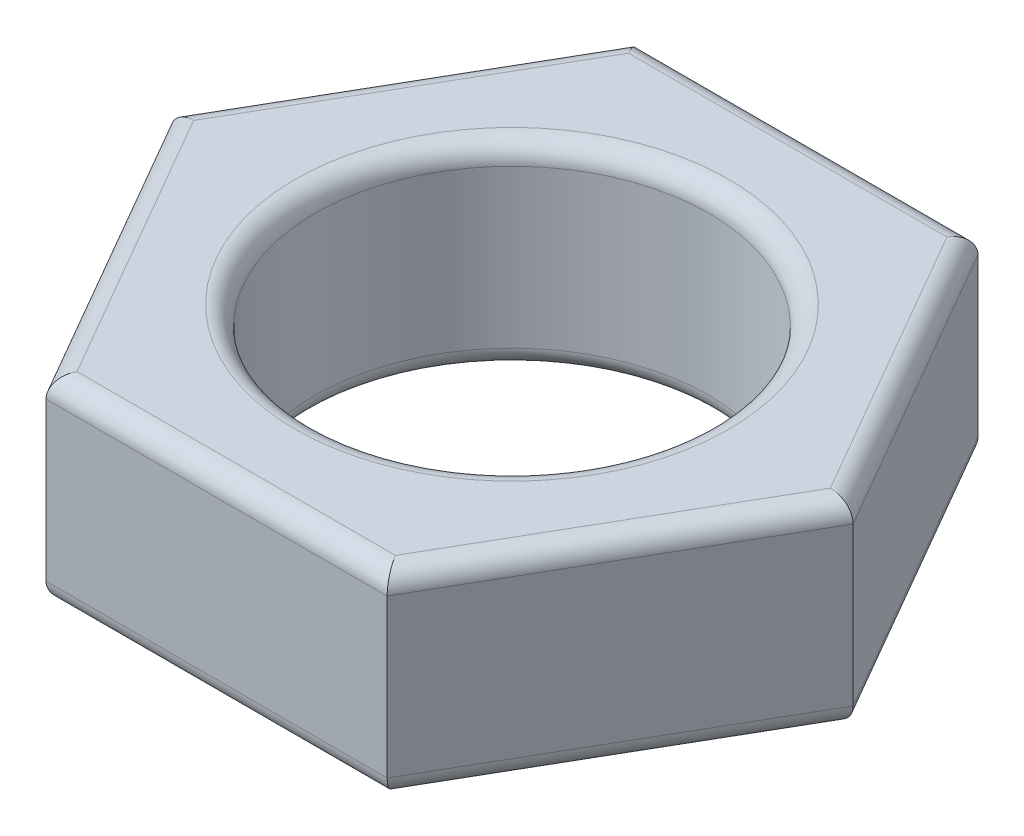
ISO-10303-21;
HEADER;
FILE_DESCRIPTION(('STEP AP214'),'2;1');
FILE_NAME('part.step','',(''),(''),'','','');
FILE_SCHEMA(('AUTOMOTIVE_DESIGN { 1 0 10303 214 1 1 1 1 }'));
ENDSEC;
DATA;
#1=APPLICATION_CONTEXT('core data for automotive mechanical design processes');
#2=APPLICATION_PROTOCOL_DEFINITION('international standard','automotive_design',2000,#1);
#3=PRODUCT_CONTEXT('',#1,'mechanical');
#4=PRODUCT('Part','Part','',(#3));
#5=PRODUCT_RELATED_PRODUCT_CATEGORY('part','',(#4));
#6=PRODUCT_DEFINITION_FORMATION('','',#4);
#7=PRODUCT_DEFINITION_CONTEXT('part definition',#1,'design');
#8=PRODUCT_DEFINITION('design','',#6,#7);
#9=PRODUCT_DEFINITION_SHAPE('','',#8);
#10=(LENGTH_UNIT() NAMED_UNIT(*) SI_UNIT(.MILLI.,.METRE.));
#11=(NAMED_UNIT(*) PLANE_ANGLE_UNIT() SI_UNIT($,.RADIAN.));
#12=(NAMED_UNIT(*) SI_UNIT($,.STERADIAN.) SOLID_ANGLE_UNIT());
#13=UNCERTAINTY_MEASURE_WITH_UNIT(LENGTH_MEASURE(1.E-05),#10,'distance_accuracy_value','');
#14=(GEOMETRIC_REPRESENTATION_CONTEXT(3) GLOBAL_UNCERTAINTY_ASSIGNED_CONTEXT((#13)) GLOBAL_UNIT_ASSIGNED_CONTEXT((#10,
#11,#12)) REPRESENTATION_CONTEXT('',''));
#15=CARTESIAN_POINT('',(0.,0.,0.));
#16=DIRECTION('',(0.,0.,1.));
#17=DIRECTION('',(1.,0.,0.));
#18=AXIS2_PLACEMENT_3D('',#15,#16,#17);
#19=CARTESIAN_POINT('',(0.,5.,0.));
#20=DIRECTION('',(0.,0.999999999999982,0.));
#21=DIRECTION('',(0.,0.,0.999999999999999));
#22=AXIS2_PLACEMENT_3D('',#19,#20,#21);
#23=PLANE('',#22);
#24=CARTESIAN_POINT('',(0.,5.,0.));
#25=DIRECTION('',(0.,0.999999999999982,0.));
#26=DIRECTION('',(0.,0.,0.999999999999999));
#27=AXIS2_PLACEMENT_3D('',#24,#25,#26);
#28=CIRCLE('',#27,5.5);
#29=CARTESIAN_POINT('',(0.,5.,5.5));
#30=VERTEX_POINT('',#29);
#31=EDGE_CURVE('E13',#30,#30,#28,.F.);
#32=ORIENTED_EDGE('',*,*,#31,.T.);
#33=EDGE_LOOP('',(#32));
#34=FACE_BOUND('',#33,.T.);
#35=DIRECTION('',(-0.5,0.,0.866025403784439));
#36=VECTOR('',#35,1.);
#37=CARTESIAN_POINT('',(-8.22724133595193,5.,0.249999999999903));
#38=LINE('',#37,#36);
#39=CARTESIAN_POINT('',(-4.04145188432742,5.,-7.00000000000002));
#40=VERTEX_POINT('',#39);
#41=CARTESIAN_POINT('',(-8.08290376865478,5.,0.));
#42=VERTEX_POINT('',#41);
#43=EDGE_CURVE('E63',#40,#42,#38,.T.);
#44=ORIENTED_EDGE('',*,*,#43,.T.);
#45=DIRECTION('',(0.5,0.,0.866025403784438));
#46=VECTOR('',#45,1.);
#47=CARTESIAN_POINT('',(-3.89711431703005,5.,7.25000000000001));
#48=LINE('',#47,#46);
#49=CARTESIAN_POINT('',(-4.04145188432747,5.,6.99999999999996));
#50=VERTEX_POINT('',#49);
#51=EDGE_CURVE('E55',#42,#50,#48,.T.);
#52=ORIENTED_EDGE('',*,*,#51,.T.);
#53=DIRECTION('',(1.,0.,0.));
#54=VECTOR('',#53,1.);
#55=CARTESIAN_POINT('',(4.33012701892227,5.,6.99999999999998));
#56=LINE('',#55,#54);
#57=CARTESIAN_POINT('',(4.04145188432736,5.,6.99999999999991));
#58=VERTEX_POINT('',#57);
#59=EDGE_CURVE('E202',#50,#58,#56,.T.);
#60=ORIENTED_EDGE('',*,*,#59,.T.);
#61=DIRECTION('',(0.5,0.,-0.866025403784439));
#62=VECTOR('',#61,1.);
#63=CARTESIAN_POINT('',(8.22724133595215,5.,-0.250000000000056));
#64=LINE('',#63,#62);
#65=CARTESIAN_POINT('',(8.08290376865464,5.,0.));
#66=VERTEX_POINT('',#65);
#67=EDGE_CURVE('E204',#58,#66,#64,.T.);
#68=ORIENTED_EDGE('',*,*,#67,.T.);
#69=DIRECTION('',(-0.5,0.,-0.866025403784439));
#70=VECTOR('',#69,1.);
#71=CARTESIAN_POINT('',(3.89711431702985,5.,-7.24999999999987));
#72=LINE('',#71,#70);
#73=CARTESIAN_POINT('',(4.04145188432725,5.,-7.00000000000006));
#74=VERTEX_POINT('',#73);
#75=EDGE_CURVE('E206',#66,#74,#72,.T.);
#76=ORIENTED_EDGE('',*,*,#75,.T.);
#77=DIRECTION('',(-1.,0.,0.));
#78=VECTOR('',#77,1.);
#79=CARTESIAN_POINT('',(-4.3301270189223,5.,-7.00000000000004));
#80=LINE('',#79,#78);
#81=EDGE_CURVE('E68',#74,#40,#80,.T.);
#82=ORIENTED_EDGE('',*,*,#81,.T.);
#83=EDGE_LOOP('',(#44,#52,#60,#68,#76,#82));
#84=FACE_BOUND('',#83,.T.);
#85=ADVANCED_FACE('F46',(#34,#84),#23,.T.);
#86=CARTESIAN_POINT('',(0.,0.,0.));
#87=DIRECTION('',(0.,0.999999999999982,0.));
#88=DIRECTION('',(0.,0.,0.999999999999999));
#89=AXIS2_PLACEMENT_3D('',#86,#87,#88);
#90=PLANE('',#89);
#91=CARTESIAN_POINT('',(0.,0.,0.));
#92=DIRECTION('',(0.,0.999999999999982,0.));
#93=DIRECTION('',(0.,0.,0.999999999999999));
#94=AXIS2_PLACEMENT_3D('',#91,#92,#93);
#95=CIRCLE('',#94,5.5);
#96=CARTESIAN_POINT('',(0.,0.,5.5));
#97=VERTEX_POINT('',#96);
#98=EDGE_CURVE('E164',#97,#97,#95,.T.);
#99=ORIENTED_EDGE('',*,*,#98,.T.);
#100=EDGE_LOOP('',(#99));
#101=FACE_BOUND('',#100,.T.);
#102=DIRECTION('',(-0.5,0.,-0.866025403784439));
#103=VECTOR('',#102,1.);
#104=CARTESIAN_POINT('',(6.06217782649099,0.,-3.50000000000004));
#105=LINE('',#104,#103);
#106=CARTESIAN_POINT('',(4.04145188432725,0.,-7.00000000000006));
#107=VERTEX_POINT('',#106);
#108=CARTESIAN_POINT('',(8.08290376865464,0.,0.));
#109=VERTEX_POINT('',#108);
#110=EDGE_CURVE('E163',#107,#109,#105,.F.);
#111=ORIENTED_EDGE('',*,*,#110,.T.);
#112=DIRECTION('',(0.5,0.,-0.866025403784439));
#113=VECTOR('',#112,1.);
#114=CARTESIAN_POINT('',(6.06217782649082,0.,3.49999999999986));
#115=LINE('',#114,#113);
#116=CARTESIAN_POINT('',(4.04145188432736,0.,6.99999999999991));
#117=VERTEX_POINT('',#116);
#118=EDGE_CURVE('E142',#109,#117,#115,.F.);
#119=ORIENTED_EDGE('',*,*,#118,.T.);
#120=DIRECTION('',(1.,0.,0.));
#121=VECTOR('',#120,1.);
#122=CARTESIAN_POINT('',(-3.60822483003176E-13,0.,6.99999999999996));
#123=LINE('',#122,#121);
#124=CARTESIAN_POINT('',(-4.04145188432747,0.,6.99999999999996));
#125=VERTEX_POINT('',#124);
#126=EDGE_CURVE('E152',#117,#125,#123,.F.);
#127=ORIENTED_EDGE('',*,*,#126,.T.);
#128=DIRECTION('',(0.5,0.,0.866025403784438));
#129=VECTOR('',#128,1.);
#130=CARTESIAN_POINT('',(-6.06217782649118,0.,3.49999999999991));
#131=LINE('',#130,#129);
#132=CARTESIAN_POINT('',(-8.08290376865478,0.,0.));
#133=VERTEX_POINT('',#132);
#134=EDGE_CURVE('E158',#125,#133,#131,.F.);
#135=ORIENTED_EDGE('',*,*,#134,.T.);
#136=DIRECTION('',(-0.5,0.,0.866025403784439));
#137=VECTOR('',#136,1.);
#138=CARTESIAN_POINT('',(-6.06217782649102,0.,-3.50000000000015));
#139=LINE('',#138,#137);
#140=CARTESIAN_POINT('',(-4.04145188432742,0.,-7.00000000000002));
#141=VERTEX_POINT('',#140);
#142=EDGE_CURVE('E264',#133,#141,#139,.F.);
#143=ORIENTED_EDGE('',*,*,#142,.T.);
#144=DIRECTION('',(-1.,0.,0.));
#145=VECTOR('',#144,1.);
#146=CARTESIAN_POINT('',(0.,0.,-7.00000000000005));
#147=LINE('',#146,#145);
#148=EDGE_CURVE('E169',#141,#107,#147,.F.);
#149=ORIENTED_EDGE('',*,*,#148,.T.);
#150=EDGE_LOOP('',(#111,#119,#127,#135,#143,#149));
#151=FACE_BOUND('',#150,.T.);
#152=ADVANCED_FACE('F161',(#101,#151),#90,.F.);
#153=CARTESIAN_POINT('',(-4.33012701892216,5.,7.49999999999998));
#154=DIRECTION('',(0.,0.,-1.));
#155=DIRECTION('',(-1.,0.,0.));
#156=AXIS2_PLACEMENT_3D('',#153,#154,#155);
#157=PLANE('',#156);
#158=DIRECTION('',(0.,-0.999999999999982,0.));
#159=VECTOR('',#158,1.);
#160=CARTESIAN_POINT('',(-4.33012701892216,5.,7.49999999999998));
#161=LINE('',#160,#159);
#162=CARTESIAN_POINT('',(-4.33012701892216,4.49999999999995,7.49999999999998));
#163=VERTEX_POINT('',#162);
#164=CARTESIAN_POINT('',(-4.33012701892221,0.499999999999945,7.50000000000006));
#165=VERTEX_POINT('',#164);
#166=EDGE_CURVE('E221',#163,#165,#161,.T.);
#167=ORIENTED_EDGE('',*,*,#166,.T.);
#168=DIRECTION('',(1.,0.,0.));
#169=VECTOR('',#168,1.);
#170=CARTESIAN_POINT('',(-4.33012701892221,0.499999999999945,7.50000000000006));
#171=LINE('',#170,#169);
#172=CARTESIAN_POINT('',(4.33012701892205,0.499999999999945,7.49999999999994));
#173=VERTEX_POINT('',#172);
#174=EDGE_CURVE('E200',#165,#173,#171,.T.);
#175=ORIENTED_EDGE('',*,*,#174,.T.);
#176=DIRECTION('',(0.,-0.999999999999982,0.));
#177=VECTOR('',#176,1.);
#178=CARTESIAN_POINT('',(4.33012701892205,5.,7.49999999999994));
#179=LINE('',#178,#177);
#180=CARTESIAN_POINT('',(4.33012701892205,4.49999999999995,7.49999999999994));
#181=VERTEX_POINT('',#180);
#182=EDGE_CURVE('E159',#181,#173,#179,.T.);
#183=ORIENTED_EDGE('',*,*,#182,.F.);
#184=DIRECTION('',(1.,0.,0.));
#185=VECTOR('',#184,1.);
#186=CARTESIAN_POINT('',(-4.33012701892216,4.49999999999995,7.49999999999998));
#187=LINE('',#186,#185);
#188=EDGE_CURVE('E198',#181,#163,#187,.F.);
#189=ORIENTED_EDGE('',*,*,#188,.T.);
#190=EDGE_LOOP('',(#167,#175,#183,#189));
#191=FACE_BOUND('',#190,.T.);
#192=ADVANCED_FACE('F288',(#191),#157,.F.);
#193=CARTESIAN_POINT('',(4.33012701892205,5.,7.49999999999994));
#194=DIRECTION('',(-0.866025403784437,0.,-0.499999999999999));
#195=DIRECTION('',(-0.5,0.,0.866025403784439));
#196=AXIS2_PLACEMENT_3D('',#193,#194,#195);
#197=PLANE('',#196);
#198=ORIENTED_EDGE('',*,*,#182,.T.);
#199=DIRECTION('',(0.5,0.,-0.866025403784439));
#200=VECTOR('',#199,1.);
#201=CARTESIAN_POINT('',(4.33012701892205,0.499999999999945,7.49999999999994));
#202=LINE('',#201,#200);
#203=CARTESIAN_POINT('',(8.66025403784437,0.499999999999945,0.));
#204=VERTEX_POINT('',#203);
#205=EDGE_CURVE('E145',#173,#204,#202,.T.);
#206=ORIENTED_EDGE('',*,*,#205,.T.);
#207=DIRECTION('',(0.,-0.999999999999982,0.));
#208=VECTOR('',#207,1.);
#209=CARTESIAN_POINT('',(8.66025403784437,5.,0.));
#210=LINE('',#209,#208);
#211=CARTESIAN_POINT('',(8.66025403784437,4.49999999999995,0.));
#212=VERTEX_POINT('',#211);
#213=EDGE_CURVE('E250',#212,#204,#210,.T.);
#214=ORIENTED_EDGE('',*,*,#213,.F.);
#215=DIRECTION('',(0.5,0.,-0.866025403784439));
#216=VECTOR('',#215,1.);
#217=CARTESIAN_POINT('',(4.33012701892205,4.49999999999995,7.49999999999994));
#218=LINE('',#217,#216);
#219=EDGE_CURVE('E178',#212,#181,#218,.F.);
#220=ORIENTED_EDGE('',*,*,#219,.T.);
#221=EDGE_LOOP('',(#198,#206,#214,#220));
#222=FACE_BOUND('',#221,.T.);
#223=ADVANCED_FACE('F255',(#222),#197,.F.);
#224=CARTESIAN_POINT('',(8.66025403784437,5.,0.));
#225=DIRECTION('',(-0.866025403784439,0.,0.5));
#226=DIRECTION('',(0.5,0.,0.866025403784439));
#227=AXIS2_PLACEMENT_3D('',#224,#225,#226);
#228=PLANE('',#227);
#229=ORIENTED_EDGE('',*,*,#213,.T.);
#230=DIRECTION('',(-0.5,0.,-0.866025403784439));
#231=VECTOR('',#230,1.);
#232=CARTESIAN_POINT('',(8.66025403784437,0.499999999999945,0.));
#233=LINE('',#232,#231);
#234=CARTESIAN_POINT('',(4.33012701892199,0.499999999999945,-7.50000000000006));
#235=VERTEX_POINT('',#234);
#236=EDGE_CURVE('E183',#204,#235,#233,.T.);
#237=ORIENTED_EDGE('',*,*,#236,.T.);
#238=DIRECTION('',(0.,-0.999999999999982,0.));
#239=VECTOR('',#238,1.);
#240=CARTESIAN_POINT('',(4.33012701892205,5.,-7.50000000000003));
#241=LINE('',#240,#239);
#242=CARTESIAN_POINT('',(4.33012701892205,4.49999999999995,-7.50000000000003));
#243=VERTEX_POINT('',#242);
#244=EDGE_CURVE('E252',#243,#235,#241,.T.);
#245=ORIENTED_EDGE('',*,*,#244,.F.);
#246=DIRECTION('',(-0.5,0.,-0.866025403784439));
#247=VECTOR('',#246,1.);
#248=CARTESIAN_POINT('',(8.66025403784437,4.49999999999995,0.));
#249=LINE('',#248,#247);
#250=EDGE_CURVE('E181',#243,#212,#249,.F.);
#251=ORIENTED_EDGE('',*,*,#250,.T.);
#252=EDGE_LOOP('',(#229,#237,#245,#251));
#253=FACE_BOUND('',#252,.T.);
#254=ADVANCED_FACE('F249',(#253),#228,.F.);
#255=CARTESIAN_POINT('',(4.33012701892205,5.,-7.50000000000003));
#256=DIRECTION('',(0.,0.,1.));
#257=DIRECTION('',(1.,0.,0.));
#258=AXIS2_PLACEMENT_3D('',#255,#256,#257);
#259=PLANE('',#258);
#260=ORIENTED_EDGE('',*,*,#244,.T.);
#261=DIRECTION('',(-1.,0.,0.));
#262=VECTOR('',#261,1.);
#263=CARTESIAN_POINT('',(4.33012701892199,0.499999999999945,-7.50000000000006));
#264=LINE('',#263,#262);
#265=CARTESIAN_POINT('',(-4.33012701892224,0.499999999999945,-7.50000000000003));
#266=VERTEX_POINT('',#265);
#267=EDGE_CURVE('E187',#235,#266,#264,.T.);
#268=ORIENTED_EDGE('',*,*,#267,.T.);
#269=DIRECTION('',(0.,-0.999999999999982,0.));
#270=VECTOR('',#269,1.);
#271=CARTESIAN_POINT('',(-4.33012701892224,5.,-7.50000000000003));
#272=LINE('',#271,#270);
#273=CARTESIAN_POINT('',(-4.33012701892224,4.49999999999995,-7.50000000000003));
#274=VERTEX_POINT('',#273);
#275=EDGE_CURVE('E259',#274,#266,#272,.T.);
#276=ORIENTED_EDGE('',*,*,#275,.F.);
#277=DIRECTION('',(-1.,0.,0.));
#278=VECTOR('',#277,1.);
#279=CARTESIAN_POINT('',(4.33012701892205,4.49999999999995,-7.50000000000003));
#280=LINE('',#279,#278);
#281=EDGE_CURVE('E185',#274,#243,#280,.F.);
#282=ORIENTED_EDGE('',*,*,#281,.T.);
#283=EDGE_LOOP('',(#260,#268,#276,#282));
#284=FACE_BOUND('',#283,.T.);
#285=ADVANCED_FACE('F276',(#284),#259,.F.);
#286=CARTESIAN_POINT('',(-4.33012701892224,5.,-7.50000000000003));
#287=DIRECTION('',(0.866025403784438,0.,0.5));
#288=DIRECTION('',(0.5,0.,-0.866025403784439));
#289=AXIS2_PLACEMENT_3D('',#286,#287,#288);
#290=PLANE('',#289);
#291=ORIENTED_EDGE('',*,*,#275,.T.);
#292=DIRECTION('',(-0.5,0.,0.866025403784439));
#293=VECTOR('',#292,1.);
#294=CARTESIAN_POINT('',(-4.33012701892224,0.499999999999945,-7.50000000000003));
#295=LINE('',#294,#293);
#296=CARTESIAN_POINT('',(-8.66025403784429,0.499999999999945,-2.22044604925031E-13));
#297=VERTEX_POINT('',#296);
#298=EDGE_CURVE('E191',#266,#297,#295,.T.);
#299=ORIENTED_EDGE('',*,*,#298,.T.);
#300=DIRECTION('',(0.,-0.999999999999982,0.));
#301=VECTOR('',#300,1.);
#302=CARTESIAN_POINT('',(-8.66025403784429,5.,-2.22044604925031E-13));
#303=LINE('',#302,#301);
#304=CARTESIAN_POINT('',(-8.66025403784429,4.49999999999995,-2.22044604925031E-13));
#305=VERTEX_POINT('',#304);
#306=EDGE_CURVE('E281',#305,#297,#303,.T.);
#307=ORIENTED_EDGE('',*,*,#306,.F.);
#308=DIRECTION('',(-0.5,0.,0.866025403784439));
#309=VECTOR('',#308,1.);
#310=CARTESIAN_POINT('',(-4.33012701892224,4.49999999999995,-7.50000000000003));
#311=LINE('',#310,#309);
#312=EDGE_CURVE('E189',#305,#274,#311,.F.);
#313=ORIENTED_EDGE('',*,*,#312,.T.);
#314=EDGE_LOOP('',(#291,#299,#307,#313));
#315=FACE_BOUND('',#314,.T.);
#316=ADVANCED_FACE('F299',(#315),#290,.F.);
#317=CARTESIAN_POINT('',(-8.66025403784429,5.,-2.22044604925031E-13));
#318=DIRECTION('',(0.866025403784438,0.,-0.5));
#319=DIRECTION('',(-0.5,0.,-0.866025403784438));
#320=AXIS2_PLACEMENT_3D('',#317,#318,#319);
#321=PLANE('',#320);
#322=ORIENTED_EDGE('',*,*,#306,.T.);
#323=DIRECTION('',(0.5,0.,0.866025403784438));
#324=VECTOR('',#323,1.);
#325=CARTESIAN_POINT('',(-8.66025403784429,0.499999999999945,-2.22044604925031E-13));
#326=LINE('',#325,#324);
#327=EDGE_CURVE('E196',#297,#165,#326,.T.);
#328=ORIENTED_EDGE('',*,*,#327,.T.);
#329=ORIENTED_EDGE('',*,*,#166,.F.);
#330=DIRECTION('',(0.5,0.,0.866025403784438));
#331=VECTOR('',#330,1.);
#332=CARTESIAN_POINT('',(-8.66025403784429,4.49999999999995,-2.22044604925031E-13));
#333=LINE('',#332,#331);
#334=EDGE_CURVE('E193',#163,#305,#333,.F.);
#335=ORIENTED_EDGE('',*,*,#334,.T.);
#336=EDGE_LOOP('',(#322,#328,#329,#335));
#337=FACE_BOUND('',#336,.T.);
#338=ADVANCED_FACE('F300',(#337),#321,.F.);
#339=CARTESIAN_POINT('',(0.,5.,0.));
#340=DIRECTION('',(0.,-0.999999999999982,0.));
#341=DIRECTION('',(0.,0.,-0.999999999999999));
#342=AXIS2_PLACEMENT_3D('',#339,#340,#341);
#343=CYLINDRICAL_SURFACE('',#342,5.);
#344=CARTESIAN_POINT('',(0.,0.499999999999945,0.));
#345=DIRECTION('',(0.,0.999999999999982,0.));
#346=DIRECTION('',(0.,0.,0.999999999999999));
#347=AXIS2_PLACEMENT_3D('',#344,#345,#346);
#348=CIRCLE('',#347,5.);
#349=CARTESIAN_POINT('',(0.,0.499999999999946,-5.));
#350=VERTEX_POINT('',#349);
#351=EDGE_CURVE('E175',#350,#350,#348,.F.);
#352=CARTESIAN_POINT('',(0.,4.49999999999995,0.));
#353=DIRECTION('',(0.,0.999999999999982,0.));
#354=DIRECTION('',(0.,0.,0.999999999999999));
#355=AXIS2_PLACEMENT_3D('',#352,#353,#354);
#356=CIRCLE('',#355,5.);
#357=CARTESIAN_POINT('',(0.,4.49999999999995,-5.));
#358=VERTEX_POINT('',#357);
#359=EDGE_CURVE('E167',#358,#358,#356,.T.);
#360=CARTESIAN_POINT('',(0.,0.499999999999946,-5.));
#361=CARTESIAN_POINT('',(0.,0.541666666666612,-5.));
#362=CARTESIAN_POINT('',(0.,0.583333333333279,-5.));
#363=CARTESIAN_POINT('',(0.,0.666666666666612,-5.));
#364=CARTESIAN_POINT('',(0.,0.708333333333279,-5.));
#365=CARTESIAN_POINT('',(0.,0.791666666666613,-5.));
#366=CARTESIAN_POINT('',(0.,0.833333333333279,-5.));
#367=CARTESIAN_POINT('',(0.,0.916666666666613,-5.));
#368=CARTESIAN_POINT('',(0.,0.95833333333328,-5.));
#369=CARTESIAN_POINT('',(0.,1.04166666666661,-5.));
#370=CARTESIAN_POINT('',(0.,1.08333333333328,-5.));
#371=CARTESIAN_POINT('',(0.,1.16666666666661,-5.));
#372=CARTESIAN_POINT('',(0.,1.20833333333328,-5.));
#373=CARTESIAN_POINT('',(0.,1.29166666666661,-5.));
#374=CARTESIAN_POINT('',(0.,1.33333333333328,-5.));
#375=CARTESIAN_POINT('',(0.,1.41666666666661,-5.));
#376=CARTESIAN_POINT('',(0.,1.45833333333328,-5.));
#377=CARTESIAN_POINT('',(0.,1.54166666666661,-5.));
#378=CARTESIAN_POINT('',(0.,1.58333333333328,-5.));
#379=CARTESIAN_POINT('',(0.,1.66666666666661,-5.));
#380=CARTESIAN_POINT('',(0.,1.70833333333328,-5.));
#381=CARTESIAN_POINT('',(0.,1.79166666666661,-5.));
#382=CARTESIAN_POINT('',(0.,1.83333333333328,-5.));
#383=CARTESIAN_POINT('',(0.,1.91666666666661,-5.));
#384=CARTESIAN_POINT('',(0.,1.95833333333328,-5.));
#385=CARTESIAN_POINT('',(0.,2.04166666666661,-5.));
#386=CARTESIAN_POINT('',(0.,2.08333333333328,-5.));
#387=CARTESIAN_POINT('',(0.,2.16666666666661,-5.));
#388=CARTESIAN_POINT('',(0.,2.20833333333328,-5.));
#389=CARTESIAN_POINT('',(0.,2.29166666666661,-5.));
#390=CARTESIAN_POINT('',(0.,2.33333333333328,-5.));
#391=CARTESIAN_POINT('',(0.,2.41666666666661,-5.));
#392=CARTESIAN_POINT('',(0.,2.45833333333328,-5.));
#393=CARTESIAN_POINT('',(0.,2.54166666666661,-5.));
#394=CARTESIAN_POINT('',(0.,2.58333333333328,-5.));
#395=CARTESIAN_POINT('',(0.,2.66666666666661,-5.));
#396=CARTESIAN_POINT('',(0.,2.70833333333328,-5.));
#397=CARTESIAN_POINT('',(0.,2.79166666666661,-5.));
#398=CARTESIAN_POINT('',(0.,2.83333333333328,-5.));
#399=CARTESIAN_POINT('',(0.,2.91666666666661,-5.));
#400=CARTESIAN_POINT('',(0.,2.95833333333328,-5.));
#401=CARTESIAN_POINT('',(0.,3.04166666666661,-5.));
#402=CARTESIAN_POINT('',(0.,3.08333333333328,-5.));
#403=CARTESIAN_POINT('',(0.,3.16666666666661,-5.));
#404=CARTESIAN_POINT('',(0.,3.20833333333328,-5.));
#405=CARTESIAN_POINT('',(0.,3.29166666666661,-5.));
#406=CARTESIAN_POINT('',(0.,3.33333333333328,-5.));
#407=CARTESIAN_POINT('',(0.,3.41666666666661,-5.));
#408=CARTESIAN_POINT('',(0.,3.45833333333328,-5.));
#409=CARTESIAN_POINT('',(0.,3.54166666666661,-5.));
#410=CARTESIAN_POINT('',(0.,3.58333333333328,-5.));
#411=CARTESIAN_POINT('',(0.,3.66666666666661,-5.));
#412=CARTESIAN_POINT('',(0.,3.70833333333328,-5.));
#413=CARTESIAN_POINT('',(0.,3.79166666666661,-5.));
#414=CARTESIAN_POINT('',(0.,3.83333333333328,-5.));
#415=CARTESIAN_POINT('',(0.,3.91666666666661,-5.));
#416=CARTESIAN_POINT('',(0.,3.95833333333328,-5.));
#417=CARTESIAN_POINT('',(0.,4.04166666666661,-5.));
#418=CARTESIAN_POINT('',(0.,4.08333333333328,-5.));
#419=CARTESIAN_POINT('',(0.,4.16666666666661,-5.));
#420=CARTESIAN_POINT('',(0.,4.20833333333328,-5.));
#421=CARTESIAN_POINT('',(0.,4.29166666666661,-5.));
#422=CARTESIAN_POINT('',(0.,4.33333333333328,-5.));
#423=CARTESIAN_POINT('',(0.,4.41666666666661,-5.));
#424=CARTESIAN_POINT('',(0.,4.45833333333328,-5.));
#425=CARTESIAN_POINT('',(0.,4.49999999999995,-5.));
#426=B_SPLINE_CURVE_WITH_KNOTS('',3,(#360,#361,#362,#363,#364,#365,#366,#367,#368,#369,#370,
#371,#372,#373,#374,#375,#376,#377,#378,#379,#380,#381,#382,#383,#384,#385,#386,#387,#388,#389,
#390,#391,#392,#393,#394,#395,#396,#397,#398,#399,#400,#401,#402,#403,#404,#405,#406,#407,#408,
#409,#410,#411,#412,#413,#414,#415,#416,#417,#418,#419,#420,#421,#422,#423,#424,#425),
.UNSPECIFIED.,.F.,.F.,(4,2,2,2,2,2,2,2,2,2,2,2,2,2,2,2,2,2,2,2,2,2,2,2,2,2,2,2,2,2,2,2,4),(0.,
0.124999999999999,0.25,0.375,0.5,0.625000000000001,0.750000000000001,0.875000000000001,1.,1.125,
1.25,1.375,1.5,1.625,1.75,1.875,2.,2.125,2.25,2.375,2.5,2.625,2.75,2.875,3.,3.125,3.25,3.375,
3.5,3.625,3.75,3.875,4.),.UNSPECIFIED.);
#427=EDGE_CURVE('BSEAM319',#350,#358,#426,.T.);
#428=ORIENTED_EDGE('',*,*,#351,.T.);
#429=ORIENTED_EDGE('',*,*,#359,.T.);
#430=ORIENTED_EDGE('',*,*,#427,.T.);
#431=ORIENTED_EDGE('',*,*,#427,.F.);
#432=EDGE_LOOP('',(#428,#430,#429,#431));
#433=FACE_BOUND('',#432,.T.);
#434=ADVANCED_FACE('F319',(#433),#343,.F.);
#435=CARTESIAN_POINT('',(0.,0.499999999999945,0.));
#436=DIRECTION('',(0.,0.999999999999982,0.));
#437=DIRECTION('',(0.,0.,0.999999999999999));
#438=AXIS2_PLACEMENT_3D('',#435,#436,#437);
#439=TOROIDAL_SURFACE('',#438,5.5,0.5);
#440=ORIENTED_EDGE('',*,*,#351,.F.);
#441=EDGE_LOOP('',(#440));
#442=FACE_BOUND('',#441,.T.);
#443=ORIENTED_EDGE('',*,*,#98,.F.);
#444=EDGE_LOOP('',(#443));
#445=FACE_BOUND('',#444,.T.);
#446=ADVANCED_FACE('F333',(#442,#445),#439,.T.);
#447=CARTESIAN_POINT('',(-3.89711431702997,0.499999999999945,-7.25000000000003));
#448=DIRECTION('',(-0.5,0.,0.866025403784439));
#449=DIRECTION('',(0.866025403784438,0.,0.5));
#450=AXIS2_PLACEMENT_3D('',#447,#448,#449);
#451=CYLINDRICAL_SURFACE('',#450,0.5);
#452=CARTESIAN_POINT('',(-4.04145188432742,0.499999999999945,-7.00000000000002));
#453=DIRECTION('',(-0.866025403784439,0.,0.5));
#454=DIRECTION('',(0.5,0.,0.866025403784438));
#455=AXIS2_PLACEMENT_3D('',#452,#453,#454);
#456=ELLIPSE('',#455,0.577350269189626,0.5);
#457=EDGE_CURVE('E215',#141,#266,#456,.F.);
#458=ORIENTED_EDGE('',*,*,#457,.F.);
#459=ORIENTED_EDGE('',*,*,#142,.F.);
#460=CARTESIAN_POINT('',(-8.08290376865478,0.499999999999945,0.));
#461=DIRECTION('',(0.,0.,0.999999999999999));
#462=DIRECTION('',(1.,0.,0.));
#463=AXIS2_PLACEMENT_3D('',#460,#461,#462);
#464=ELLIPSE('',#463,0.577350269189626,0.5);
#465=EDGE_CURVE('E218',#297,#133,#464,.T.);
#466=ORIENTED_EDGE('',*,*,#465,.F.);
#467=ORIENTED_EDGE('',*,*,#298,.F.);
#468=EDGE_LOOP('',(#458,#459,#466,#467));
#469=FACE_BOUND('',#468,.T.);
#470=ADVANCED_FACE('F297',(#469),#451,.T.);
#471=CARTESIAN_POINT('',(-8.22724133595221,0.499999999999945,-0.250000000000014));
#472=DIRECTION('',(0.5,0.,0.866025403784438));
#473=DIRECTION('',(0.866025403784438,0.,-0.5));
#474=AXIS2_PLACEMENT_3D('',#471,#472,#473);
#475=CYLINDRICAL_SURFACE('',#474,0.5);
#476=ORIENTED_EDGE('',*,*,#465,.T.);
#477=ORIENTED_EDGE('',*,*,#134,.F.);
#478=CARTESIAN_POINT('',(-4.04145188432747,0.499999999999945,6.99999999999996));
#479=DIRECTION('',(0.866025403784437,0.,0.499999999999999));
#480=DIRECTION('',(0.5,0.,-0.866025403784439));
#481=AXIS2_PLACEMENT_3D('',#478,#479,#480);
#482=ELLIPSE('',#481,0.577350269189626,0.5);
#483=EDGE_CURVE('E155',#165,#125,#482,.T.);
#484=ORIENTED_EDGE('',*,*,#483,.F.);
#485=ORIENTED_EDGE('',*,*,#327,.F.);
#486=EDGE_LOOP('',(#476,#477,#484,#485));
#487=FACE_BOUND('',#486,.T.);
#488=ADVANCED_FACE('F294',(#487),#475,.T.);
#489=CARTESIAN_POINT('',(4.3301270189221,0.499999999999945,-7.));
#490=DIRECTION('',(-1.,0.,0.));
#491=DIRECTION('',(0.,0.,1.));
#492=AXIS2_PLACEMENT_3D('',#489,#490,#491);
#493=CYLINDRICAL_SURFACE('',#492,0.5);
#494=ORIENTED_EDGE('',*,*,#457,.T.);
#495=ORIENTED_EDGE('',*,*,#267,.F.);
#496=CARTESIAN_POINT('',(4.04145188432725,0.499999999999945,-7.00000000000006));
#497=DIRECTION('',(-0.866025403784437,0.,-0.499999999999999));
#498=DIRECTION('',(-0.5,0.,0.866025403784439));
#499=AXIS2_PLACEMENT_3D('',#496,#497,#498);
#500=ELLIPSE('',#499,0.577350269189626,0.5);
#501=EDGE_CURVE('E148',#107,#235,#500,.F.);
#502=ORIENTED_EDGE('',*,*,#501,.F.);
#503=ORIENTED_EDGE('',*,*,#148,.F.);
#504=EDGE_LOOP('',(#494,#495,#502,#503));
#505=FACE_BOUND('',#504,.T.);
#506=ADVANCED_FACE('F271',(#505),#493,.T.);
#507=CARTESIAN_POINT('',(-4.33012701892233,0.499999999999945,6.99999999999987));
#508=DIRECTION('',(1.,0.,0.));
#509=DIRECTION('',(0.,0.,-1.));
#510=AXIS2_PLACEMENT_3D('',#507,#508,#509);
#511=CYLINDRICAL_SURFACE('',#510,0.5);
#512=ORIENTED_EDGE('',*,*,#483,.T.);
#513=ORIENTED_EDGE('',*,*,#126,.F.);
#514=CARTESIAN_POINT('',(4.04145188432736,0.499999999999945,6.99999999999991));
#515=DIRECTION('',(0.866025403784439,0.,-0.5));
#516=DIRECTION('',(0.5,0.,0.866025403784439));
#517=AXIS2_PLACEMENT_3D('',#514,#515,#516);
#518=ELLIPSE('',#517,0.577350269189626,0.5);
#519=EDGE_CURVE('E138',#173,#117,#518,.T.);
#520=ORIENTED_EDGE('',*,*,#519,.F.);
#521=ORIENTED_EDGE('',*,*,#174,.F.);
#522=EDGE_LOOP('',(#512,#513,#520,#521));
#523=FACE_BOUND('',#522,.T.);
#524=ADVANCED_FACE('F153',(#523),#511,.T.);
#525=CARTESIAN_POINT('',(8.22724133595185,0.499999999999945,0.249999999999771));
#526=DIRECTION('',(-0.5,0.,-0.866025403784439));
#527=DIRECTION('',(-0.866025403784439,0.,0.5));
#528=AXIS2_PLACEMENT_3D('',#525,#526,#527);
#529=CYLINDRICAL_SURFACE('',#528,0.5);
#530=ORIENTED_EDGE('',*,*,#501,.T.);
#531=ORIENTED_EDGE('',*,*,#236,.F.);
#532=CARTESIAN_POINT('',(8.08290376865464,0.499999999999945,0.));
#533=DIRECTION('',(0.,0.,-1.));
#534=DIRECTION('',(-0.999999999999999,0.,0.));
#535=AXIS2_PLACEMENT_3D('',#532,#533,#534);
#536=ELLIPSE('',#535,0.577350269189626,0.5);
#537=EDGE_CURVE('E149',#109,#204,#536,.F.);
#538=ORIENTED_EDGE('',*,*,#537,.F.);
#539=ORIENTED_EDGE('',*,*,#110,.F.);
#540=EDGE_LOOP('',(#530,#531,#538,#539));
#541=FACE_BOUND('',#540,.T.);
#542=ADVANCED_FACE('F274',(#541),#529,.T.);
#543=CARTESIAN_POINT('',(3.89711431702991,0.499999999999945,7.24999999999992));
#544=DIRECTION('',(0.5,0.,-0.866025403784439));
#545=DIRECTION('',(-0.866025403784437,0.,-0.499999999999999));
#546=AXIS2_PLACEMENT_3D('',#543,#544,#545);
#547=CYLINDRICAL_SURFACE('',#546,0.5);
#548=ORIENTED_EDGE('',*,*,#519,.T.);
#549=ORIENTED_EDGE('',*,*,#118,.F.);
#550=ORIENTED_EDGE('',*,*,#537,.T.);
#551=ORIENTED_EDGE('',*,*,#205,.F.);
#552=EDGE_LOOP('',(#548,#549,#550,#551));
#553=FACE_BOUND('',#552,.T.);
#554=ADVANCED_FACE('F140',(#553),#547,.T.);
#555=CARTESIAN_POINT('',(0.,4.49999999999995,0.));
#556=DIRECTION('',(0.,0.999999999999982,0.));
#557=DIRECTION('',(0.,0.,0.999999999999999));
#558=AXIS2_PLACEMENT_3D('',#555,#556,#557);
#559=TOROIDAL_SURFACE('',#558,5.5,0.5);
#560=ORIENTED_EDGE('',*,*,#31,.F.);
#561=EDGE_LOOP('',(#560));
#562=FACE_BOUND('',#561,.T.);
#563=ORIENTED_EDGE('',*,*,#359,.F.);
#564=EDGE_LOOP('',(#563));
#565=FACE_BOUND('',#564,.T.);
#566=ADVANCED_FACE('F339',(#562,#565),#559,.T.);
#567=CARTESIAN_POINT('',(6.06217782649099,4.49999999999995,-3.50000000000004));
#568=DIRECTION('',(0.5,0.,0.866025403784439));
#569=DIRECTION('',(0.866025403784439,0.,-0.5));
#570=AXIS2_PLACEMENT_3D('',#567,#568,#569);
#571=CYLINDRICAL_SURFACE('',#570,0.5);
#572=CARTESIAN_POINT('',(8.08290376865464,4.49999999999995,0.));
#573=DIRECTION('',(0.,0.,1.));
#574=DIRECTION('',(-0.999999999999999,0.,0.));
#575=AXIS2_PLACEMENT_3D('',#572,#573,#574);
#576=ELLIPSE('',#575,0.577350269189626,0.5);
#577=EDGE_CURVE('E231',#212,#66,#576,.T.);
#578=ORIENTED_EDGE('',*,*,#577,.F.);
#579=ORIENTED_EDGE('',*,*,#250,.F.);
#580=CARTESIAN_POINT('',(4.04145188432725,4.49999999999995,-7.00000000000006));
#581=DIRECTION('',(0.866025403784437,0.,0.499999999999999));
#582=DIRECTION('',(-0.5,0.,0.866025403784439));
#583=AXIS2_PLACEMENT_3D('',#580,#581,#582);
#584=ELLIPSE('',#583,0.577350269189626,0.5);
#585=EDGE_CURVE('E50',#74,#243,#584,.F.);
#586=ORIENTED_EDGE('',*,*,#585,.F.);
#587=ORIENTED_EDGE('',*,*,#75,.F.);
#588=EDGE_LOOP('',(#578,#579,#586,#587));
#589=FACE_BOUND('',#588,.T.);
#590=ADVANCED_FACE('F48',(#589),#571,.T.);
#591=CARTESIAN_POINT('',(0.,4.49999999999995,-7.00000000000005));
#592=DIRECTION('',(1.,0.,0.));
#593=DIRECTION('',(0.,0.,-1.));
#594=AXIS2_PLACEMENT_3D('',#591,#592,#593);
#595=CYLINDRICAL_SURFACE('',#594,0.5);
#596=ORIENTED_EDGE('',*,*,#585,.T.);
#597=ORIENTED_EDGE('',*,*,#281,.F.);
#598=CARTESIAN_POINT('',(-4.04145188432742,4.49999999999995,-7.00000000000002));
#599=DIRECTION('',(0.866025403784439,0.,-0.5));
#600=DIRECTION('',(0.5,0.,0.866025403784438));
#601=AXIS2_PLACEMENT_3D('',#598,#599,#600);
#602=ELLIPSE('',#601,0.577350269189626,0.5);
#603=EDGE_CURVE('E229',#40,#274,#602,.F.);
#604=ORIENTED_EDGE('',*,*,#603,.F.);
#605=ORIENTED_EDGE('',*,*,#81,.F.);
#606=EDGE_LOOP('',(#596,#597,#604,#605));
#607=FACE_BOUND('',#606,.T.);
#608=ADVANCED_FACE('F241',(#607),#595,.T.);
#609=CARTESIAN_POINT('',(6.06217782649085,4.49999999999995,3.49999999999989));
#610=DIRECTION('',(-0.5,0.,0.866025403784439));
#611=DIRECTION('',(0.866025403784437,0.,0.499999999999999));
#612=AXIS2_PLACEMENT_3D('',#609,#610,#611);
#613=CYLINDRICAL_SURFACE('',#612,0.5);
#614=ORIENTED_EDGE('',*,*,#577,.T.);
#615=ORIENTED_EDGE('',*,*,#67,.F.);
#616=CARTESIAN_POINT('',(4.04145188432736,4.49999999999995,6.99999999999991));
#617=DIRECTION('',(-0.866025403784439,0.,0.5));
#618=DIRECTION('',(-0.5,0.,-0.866025403784439));
#619=AXIS2_PLACEMENT_3D('',#616,#617,#618);
#620=ELLIPSE('',#619,0.577350269189626,0.5);
#621=EDGE_CURVE('E226',#181,#58,#620,.T.);
#622=ORIENTED_EDGE('',*,*,#621,.F.);
#623=ORIENTED_EDGE('',*,*,#219,.F.);
#624=EDGE_LOOP('',(#614,#615,#622,#623));
#625=FACE_BOUND('',#624,.T.);
#626=ADVANCED_FACE('F360',(#625),#613,.T.);
#627=CARTESIAN_POINT('',(-6.06217782649102,4.49999999999995,-3.50000000000015));
#628=DIRECTION('',(0.5,0.,-0.866025403784439));
#629=DIRECTION('',(-0.866025403784438,0.,-0.5));
#630=AXIS2_PLACEMENT_3D('',#627,#628,#629);
#631=CYLINDRICAL_SURFACE('',#630,0.5);
#632=ORIENTED_EDGE('',*,*,#603,.T.);
#633=ORIENTED_EDGE('',*,*,#312,.F.);
#634=CARTESIAN_POINT('',(-8.08290376865478,4.49999999999995,0.));
#635=DIRECTION('',(0.,0.,-0.999999999999999));
#636=DIRECTION('',(1.,0.,0.));
#637=AXIS2_PLACEMENT_3D('',#634,#635,#636);
#638=ELLIPSE('',#637,0.577350269189626,0.5);
#639=EDGE_CURVE('E224',#42,#305,#638,.F.);
#640=ORIENTED_EDGE('',*,*,#639,.F.);
#641=ORIENTED_EDGE('',*,*,#43,.F.);
#642=EDGE_LOOP('',(#632,#633,#640,#641));
#643=FACE_BOUND('',#642,.T.);
#644=ADVANCED_FACE('F357',(#643),#631,.T.);
#645=CARTESIAN_POINT('',(-3.60822483003176E-13,4.49999999999995,6.99999999999996));
#646=DIRECTION('',(-1.,0.,0.));
#647=DIRECTION('',(0.,0.,1.));
#648=AXIS2_PLACEMENT_3D('',#645,#646,#647);
#649=CYLINDRICAL_SURFACE('',#648,0.5);
#650=ORIENTED_EDGE('',*,*,#621,.T.);
#651=ORIENTED_EDGE('',*,*,#59,.F.);
#652=CARTESIAN_POINT('',(-4.04145188432747,4.49999999999995,6.99999999999996));
#653=DIRECTION('',(-0.866025403784437,0.,-0.499999999999999));
#654=DIRECTION('',(-0.5,0.,0.866025403784439));
#655=AXIS2_PLACEMENT_3D('',#652,#653,#654);
#656=ELLIPSE('',#655,0.577350269189626,0.5);
#657=EDGE_CURVE('E222',#163,#50,#656,.T.);
#658=ORIENTED_EDGE('',*,*,#657,.F.);
#659=ORIENTED_EDGE('',*,*,#188,.F.);
#660=EDGE_LOOP('',(#650,#651,#658,#659));
#661=FACE_BOUND('',#660,.T.);
#662=ADVANCED_FACE('F308',(#661),#649,.T.);
#663=CARTESIAN_POINT('',(-6.06217782649118,4.49999999999995,3.49999999999991));
#664=DIRECTION('',(-0.5,0.,-0.866025403784438));
#665=DIRECTION('',(-0.866025403784438,0.,0.5));
#666=AXIS2_PLACEMENT_3D('',#663,#664,#665);
#667=CYLINDRICAL_SURFACE('',#666,0.5);
#668=ORIENTED_EDGE('',*,*,#639,.T.);
#669=ORIENTED_EDGE('',*,*,#334,.F.);
#670=ORIENTED_EDGE('',*,*,#657,.T.);
#671=ORIENTED_EDGE('',*,*,#51,.F.);
#672=EDGE_LOOP('',(#668,#669,#670,#671));
#673=FACE_BOUND('',#672,.T.);
#674=ADVANCED_FACE('F303',(#673),#667,.T.);
#675=CLOSED_SHELL('',(#85,#152,#192,#223,#254,#285,#316,#338,#434,#446,#470,#488,#506,#524,#542,
#554,#566,#590,#608,#626,#644,#662,#674));
#676=MANIFOLD_SOLID_BREP('B2',#675);
#677=ADVANCED_BREP_SHAPE_REPRESENTATION('',(#18,#676),#14);
#678=SHAPE_DEFINITION_REPRESENTATION(#9,#677);
ENDSEC;
END-ISO-10303-21;
